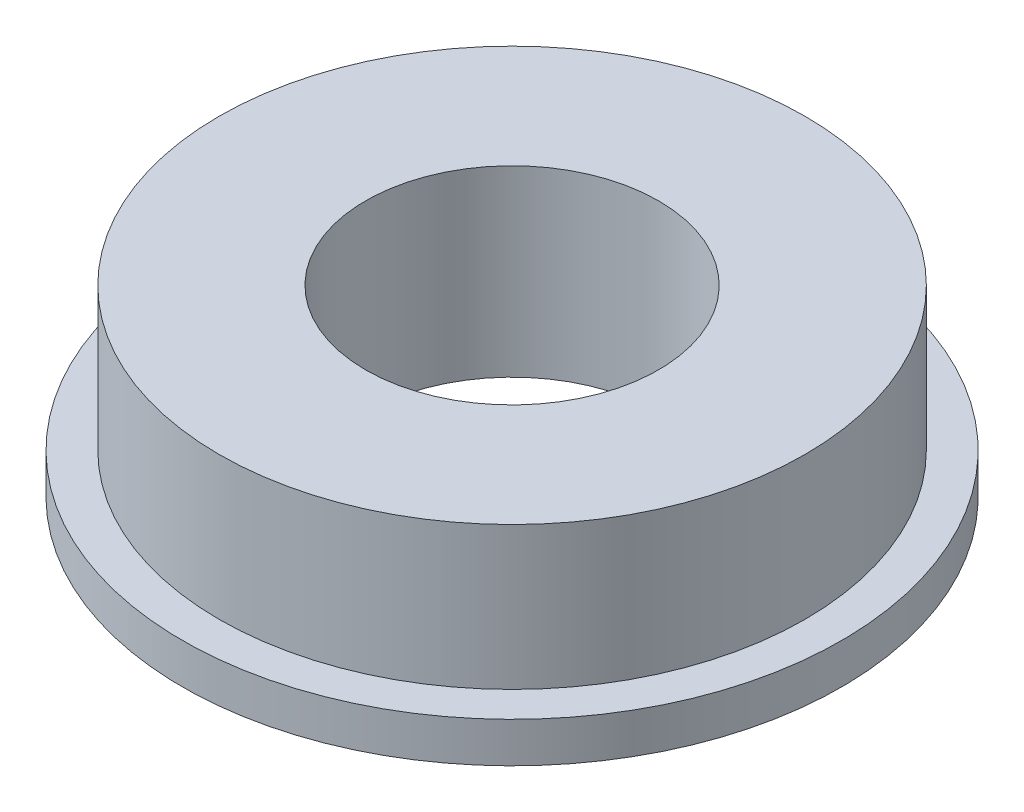
ISO-10303-21;
HEADER;
FILE_DESCRIPTION(('STEP AP214'),'2;1');
FILE_NAME('part.step','',(''),(''),'','','');
FILE_SCHEMA(('AUTOMOTIVE_DESIGN { 1 0 10303 214 1 1 1 1 }'));
ENDSEC;
DATA;
#1=APPLICATION_CONTEXT('core data for automotive mechanical design processes');
#2=APPLICATION_PROTOCOL_DEFINITION('international standard','automotive_design',2000,#1);
#3=PRODUCT_CONTEXT('',#1,'mechanical');
#4=PRODUCT('Part','Part','',(#3));
#5=PRODUCT_RELATED_PRODUCT_CATEGORY('part','',(#4));
#6=PRODUCT_DEFINITION_FORMATION('','',#4);
#7=PRODUCT_DEFINITION_CONTEXT('part definition',#1,'design');
#8=PRODUCT_DEFINITION('design','',#6,#7);
#9=PRODUCT_DEFINITION_SHAPE('','',#8);
#10=(LENGTH_UNIT() NAMED_UNIT(*) SI_UNIT(.MILLI.,.METRE.));
#11=(NAMED_UNIT(*) PLANE_ANGLE_UNIT() SI_UNIT($,.RADIAN.));
#12=(NAMED_UNIT(*) SI_UNIT($,.STERADIAN.) SOLID_ANGLE_UNIT());
#13=UNCERTAINTY_MEASURE_WITH_UNIT(LENGTH_MEASURE(1.E-05),#10,'distance_accuracy_value','');
#14=(GEOMETRIC_REPRESENTATION_CONTEXT(3) GLOBAL_UNCERTAINTY_ASSIGNED_CONTEXT((#13)) GLOBAL_UNIT_ASSIGNED_CONTEXT((#10,
#11,#12)) REPRESENTATION_CONTEXT('',''));
#15=CARTESIAN_POINT('',(0.,0.,0.));
#16=DIRECTION('',(0.,0.,1.));
#17=DIRECTION('',(1.,0.,0.));
#18=AXIS2_PLACEMENT_3D('',#15,#16,#17);
#19=CARTESIAN_POINT('',(0.,3.9,0.));
#20=DIRECTION('',(0.,1.,0.));
#21=DIRECTION('',(0.,0.,1.));
#22=AXIS2_PLACEMENT_3D('',#19,#20,#21);
#23=PLANE('',#22);
#24=CARTESIAN_POINT('',(0.,3.9,0.));
#25=DIRECTION('',(0.,1.,0.));
#26=DIRECTION('',(0.,0.,1.));
#27=AXIS2_PLACEMENT_3D('',#24,#25,#26);
#28=CIRCLE('',#27,8.);
#29=CARTESIAN_POINT('',(0.,3.9,8.));
#30=VERTEX_POINT('',#29);
#31=EDGE_CURVE('E10',#30,#30,#28,.T.);
#32=ORIENTED_EDGE('',*,*,#31,.T.);
#33=EDGE_LOOP('',(#32));
#34=FACE_BOUND('',#33,.T.);
#35=CARTESIAN_POINT('',(0.,3.9,0.));
#36=DIRECTION('',(0.,1.,0.));
#37=DIRECTION('',(0.,0.,1.));
#38=AXIS2_PLACEMENT_3D('',#35,#36,#37);
#39=CIRCLE('',#38,4.);
#40=CARTESIAN_POINT('',(0.,3.9,4.));
#41=VERTEX_POINT('',#40);
#42=EDGE_CURVE('E40',#41,#41,#39,.T.);
#43=ORIENTED_EDGE('',*,*,#42,.F.);
#44=EDGE_LOOP('',(#43));
#45=FACE_BOUND('',#44,.T.);
#46=ADVANCED_FACE('F32',(#34,#45),#23,.T.);
#47=CARTESIAN_POINT('',(0.,3.9,0.));
#48=DIRECTION('',(0.,-1.,0.));
#49=DIRECTION('',(0.,0.,-1.));
#50=AXIS2_PLACEMENT_3D('',#47,#48,#49);
#51=CYLINDRICAL_SURFACE('',#50,8.);
#52=ORIENTED_EDGE('',*,*,#31,.F.);
#53=EDGE_LOOP('',(#52));
#54=FACE_BOUND('',#53,.T.);
#55=CARTESIAN_POINT('',(0.,0.,0.));
#56=DIRECTION('',(0.,1.,0.));
#57=DIRECTION('',(0.,0.,1.));
#58=AXIS2_PLACEMENT_3D('',#55,#56,#57);
#59=CIRCLE('',#58,8.);
#60=CARTESIAN_POINT('',(0.,0.,8.));
#61=VERTEX_POINT('',#60);
#62=EDGE_CURVE('E36',#61,#61,#59,.T.);
#63=ORIENTED_EDGE('',*,*,#62,.T.);
#64=EDGE_LOOP('',(#63));
#65=FACE_BOUND('',#64,.T.);
#66=ADVANCED_FACE('F34',(#54,#65),#51,.T.);
#67=CARTESIAN_POINT('',(0.,3.9,0.));
#68=DIRECTION('',(0.,-1.,0.));
#69=DIRECTION('',(0.,0.,-1.));
#70=AXIS2_PLACEMENT_3D('',#67,#68,#69);
#71=CYLINDRICAL_SURFACE('',#70,4.);
#72=ORIENTED_EDGE('',*,*,#42,.T.);
#73=EDGE_LOOP('',(#72));
#74=FACE_BOUND('',#73,.T.);
#75=CARTESIAN_POINT('',(0.,-1.1,0.));
#76=DIRECTION('',(0.,-1.,0.));
#77=DIRECTION('',(0.,0.,-1.));
#78=AXIS2_PLACEMENT_3D('',#75,#76,#77);
#79=CIRCLE('',#78,4.);
#80=CARTESIAN_POINT('',(0.,-1.1,-4.));
#81=VERTEX_POINT('',#80);
#82=EDGE_CURVE('E50',#81,#81,#79,.T.);
#83=ORIENTED_EDGE('',*,*,#82,.T.);
#84=EDGE_LOOP('',(#83));
#85=FACE_BOUND('',#84,.T.);
#86=ADVANCED_FACE('F56',(#74,#85),#71,.F.);
#87=CARTESIAN_POINT('',(0.,-1.1,0.));
#88=DIRECTION('',(0.,-1.,0.));
#89=DIRECTION('',(0.,0.,-1.));
#90=AXIS2_PLACEMENT_3D('',#87,#88,#89);
#91=PLANE('',#90);
#92=CARTESIAN_POINT('',(0.,-1.1,0.));
#93=DIRECTION('',(0.,-1.,0.));
#94=DIRECTION('',(0.,0.,-1.));
#95=AXIS2_PLACEMENT_3D('',#92,#93,#94);
#96=CIRCLE('',#95,9.);
#97=CARTESIAN_POINT('',(0.,-1.1,-9.));
#98=VERTEX_POINT('',#97);
#99=EDGE_CURVE('E49',#98,#98,#96,.T.);
#100=ORIENTED_EDGE('',*,*,#99,.T.);
#101=EDGE_LOOP('',(#100));
#102=FACE_BOUND('',#101,.T.);
#103=ORIENTED_EDGE('',*,*,#82,.F.);
#104=EDGE_LOOP('',(#103));
#105=FACE_BOUND('',#104,.T.);
#106=ADVANCED_FACE('F58',(#102,#105),#91,.T.);
#107=CARTESIAN_POINT('',(0.,0.,0.));
#108=DIRECTION('',(0.,-1.,0.));
#109=DIRECTION('',(0.,0.,-1.));
#110=AXIS2_PLACEMENT_3D('',#107,#108,#109);
#111=PLANE('',#110);
#112=ORIENTED_EDGE('',*,*,#62,.F.);
#113=EDGE_LOOP('',(#112));
#114=FACE_BOUND('',#113,.T.);
#115=CARTESIAN_POINT('',(0.,0.,0.));
#116=DIRECTION('',(0.,-1.,0.));
#117=DIRECTION('',(0.,0.,-1.));
#118=AXIS2_PLACEMENT_3D('',#115,#116,#117);
#119=CIRCLE('',#118,9.);
#120=CARTESIAN_POINT('',(0.,0.,-9.));
#121=VERTEX_POINT('',#120);
#122=EDGE_CURVE('E46',#121,#121,#119,.T.);
#123=ORIENTED_EDGE('',*,*,#122,.F.);
#124=EDGE_LOOP('',(#123));
#125=FACE_BOUND('',#124,.T.);
#126=ADVANCED_FACE('F60',(#114,#125),#111,.F.);
#127=CARTESIAN_POINT('',(0.,-1.1,0.));
#128=DIRECTION('',(0.,1.,0.));
#129=DIRECTION('',(0.,0.,1.));
#130=AXIS2_PLACEMENT_3D('',#127,#128,#129);
#131=CYLINDRICAL_SURFACE('',#130,9.);
#132=ORIENTED_EDGE('',*,*,#99,.F.);
#133=EDGE_LOOP('',(#132));
#134=FACE_BOUND('',#133,.T.);
#135=ORIENTED_EDGE('',*,*,#122,.T.);
#136=EDGE_LOOP('',(#135));
#137=FACE_BOUND('',#136,.T.);
#138=ADVANCED_FACE('F67',(#134,#137),#131,.T.);
#139=CLOSED_SHELL('',(#46,#66,#86,#106,#126,#138));
#140=MANIFOLD_SOLID_BREP('B2',#139);
#141=ADVANCED_BREP_SHAPE_REPRESENTATION('',(#18,#140),#14);
#142=SHAPE_DEFINITION_REPRESENTATION(#9,#141);
ENDSEC;
END-ISO-10303-21;
